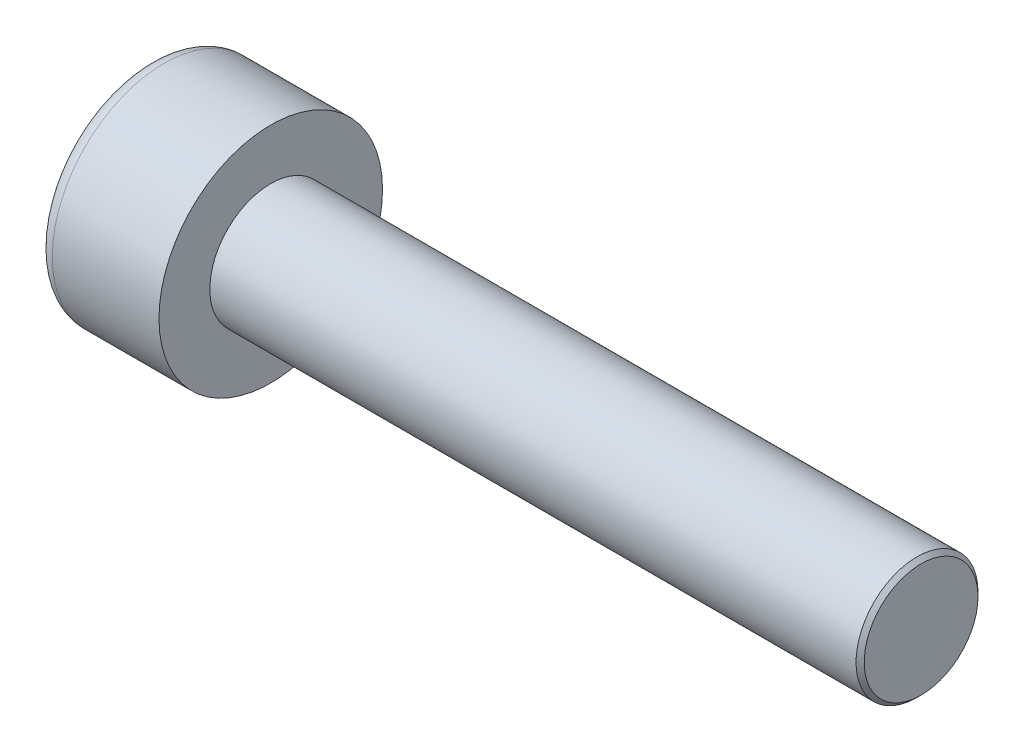
ISO-10303-21;
HEADER;
FILE_DESCRIPTION(('STEP AP214'),'2;1');
FILE_NAME('part.step','',(''),(''),'','','');
FILE_SCHEMA(('AUTOMOTIVE_DESIGN { 1 0 10303 214 1 1 1 1 }'));
ENDSEC;
DATA;
#1=APPLICATION_CONTEXT('core data for automotive mechanical design processes');
#2=APPLICATION_PROTOCOL_DEFINITION('international standard','automotive_design',2000,#1);
#3=PRODUCT_CONTEXT('',#1,'mechanical');
#4=PRODUCT('Part','Part','',(#3));
#5=PRODUCT_RELATED_PRODUCT_CATEGORY('part','',(#4));
#6=PRODUCT_DEFINITION_FORMATION('','',#4);
#7=PRODUCT_DEFINITION_CONTEXT('part definition',#1,'design');
#8=PRODUCT_DEFINITION('design','',#6,#7);
#9=PRODUCT_DEFINITION_SHAPE('','',#8);
#10=(LENGTH_UNIT() NAMED_UNIT(*) SI_UNIT(.MILLI.,.METRE.));
#11=(NAMED_UNIT(*) PLANE_ANGLE_UNIT() SI_UNIT($,.RADIAN.));
#12=(NAMED_UNIT(*) SI_UNIT($,.STERADIAN.) SOLID_ANGLE_UNIT());
#13=UNCERTAINTY_MEASURE_WITH_UNIT(LENGTH_MEASURE(1.E-05),#10,'distance_accuracy_value','');
#14=(GEOMETRIC_REPRESENTATION_CONTEXT(3) GLOBAL_UNCERTAINTY_ASSIGNED_CONTEXT((#13)) GLOBAL_UNIT_ASSIGNED_CONTEXT((#10,
#11,#12)) REPRESENTATION_CONTEXT('',''));
#15=CARTESIAN_POINT('',(0.,0.,0.));
#16=DIRECTION('',(0.,0.,1.));
#17=DIRECTION('',(1.,0.,0.));
#18=AXIS2_PLACEMENT_3D('',#15,#16,#17);
#19=CARTESIAN_POINT('',(1.3,0.,-1.44337567297406));
#20=DIRECTION('',(1.,0.,0.));
#21=DIRECTION('',(0.,0.,-1.));
#22=AXIS2_PLACEMENT_3D('',#19,#20,#21);
#23=PLANE('',#22);
#24=CARTESIAN_POINT('',(1.3,0.,0.));
#25=DIRECTION('',(1.,0.,0.));
#26=DIRECTION('',(0.,0.,-1.));
#27=AXIS2_PLACEMENT_3D('',#24,#25,#26);
#28=CIRCLE('',#27,1.25);
#29=CARTESIAN_POINT('',(1.3,-0.625,-1.08253175473055));
#30=VERTEX_POINT('',#29);
#31=CARTESIAN_POINT('',(1.3,-1.25,0.));
#32=VERTEX_POINT('',#31);
#33=EDGE_CURVE('E172',#30,#32,#28,.F.);
#34=ORIENTED_EDGE('',*,*,#33,.F.);
#35=DIRECTION('',(0.,0.866025403784439,-0.5));
#36=VECTOR('',#35,1.);
#37=CARTESIAN_POINT('',(1.3,-1.25,-0.721687836487033));
#38=LINE('',#37,#36);
#39=CARTESIAN_POINT('',(1.3,-1.25,-0.721687836487033));
#40=VERTEX_POINT('',#39);
#41=EDGE_CURVE('E181',#40,#30,#38,.T.);
#42=ORIENTED_EDGE('',*,*,#41,.F.);
#43=DIRECTION('',(0.,0.,-1.));
#44=VECTOR('',#43,1.);
#45=CARTESIAN_POINT('',(1.3,-1.25,0.721687836487032));
#46=LINE('',#45,#44);
#47=EDGE_CURVE('E203',#32,#40,#46,.T.);
#48=ORIENTED_EDGE('',*,*,#47,.F.);
#49=EDGE_LOOP('',(#34,#42,#48));
#50=FACE_BOUND('',#49,.T.);
#51=ADVANCED_FACE('F47',(#50),#23,.F.);
#52=CARTESIAN_POINT('',(1.3,-0.625,1.08253175473055));
#53=VERTEX_POINT('',#52);
#54=EDGE_CURVE('E330',#32,#53,#28,.F.);
#55=ORIENTED_EDGE('',*,*,#54,.F.);
#56=CARTESIAN_POINT('',(1.3,-1.25,0.721687836487032));
#57=VERTEX_POINT('',#56);
#58=EDGE_CURVE('E204',#57,#32,#46,.T.);
#59=ORIENTED_EDGE('',*,*,#58,.F.);
#60=DIRECTION('',(0.,-0.866025403784439,-0.5));
#61=VECTOR('',#60,1.);
#62=CARTESIAN_POINT('',(1.3,0.,1.44337567297406));
#63=LINE('',#62,#61);
#64=EDGE_CURVE('E198',#53,#57,#63,.T.);
#65=ORIENTED_EDGE('',*,*,#64,.F.);
#66=EDGE_LOOP('',(#55,#59,#65));
#67=FACE_BOUND('',#66,.T.);
#68=ADVANCED_FACE('F137',(#67),#23,.F.);
#69=CARTESIAN_POINT('',(1.3,0.625,1.08253175473055));
#70=VERTEX_POINT('',#69);
#71=EDGE_CURVE('E328',#53,#70,#28,.F.);
#72=ORIENTED_EDGE('',*,*,#71,.F.);
#73=CARTESIAN_POINT('',(1.3,0.,1.44337567297406));
#74=VERTEX_POINT('',#73);
#75=EDGE_CURVE('E199',#74,#53,#63,.T.);
#76=ORIENTED_EDGE('',*,*,#75,.F.);
#77=DIRECTION('',(0.,-0.866025403784439,0.5));
#78=VECTOR('',#77,1.);
#79=CARTESIAN_POINT('',(1.3,1.25,0.721687836487032));
#80=LINE('',#79,#78);
#81=EDGE_CURVE('E193',#70,#74,#80,.T.);
#82=ORIENTED_EDGE('',*,*,#81,.F.);
#83=EDGE_LOOP('',(#72,#76,#82));
#84=FACE_BOUND('',#83,.T.);
#85=ADVANCED_FACE('F143',(#84),#23,.F.);
#86=CARTESIAN_POINT('',(1.3,1.25,0.));
#87=VERTEX_POINT('',#86);
#88=EDGE_CURVE('E169',#70,#87,#28,.F.);
#89=ORIENTED_EDGE('',*,*,#88,.F.);
#90=CARTESIAN_POINT('',(1.3,1.25,0.721687836487032));
#91=VERTEX_POINT('',#90);
#92=EDGE_CURVE('E194',#91,#70,#80,.T.);
#93=ORIENTED_EDGE('',*,*,#92,.F.);
#94=DIRECTION('',(0.,0.,1.));
#95=VECTOR('',#94,1.);
#96=CARTESIAN_POINT('',(1.3,1.25,-0.721687836487032));
#97=LINE('',#96,#95);
#98=EDGE_CURVE('E186',#87,#91,#97,.T.);
#99=ORIENTED_EDGE('',*,*,#98,.F.);
#100=EDGE_LOOP('',(#89,#93,#99));
#101=FACE_BOUND('',#100,.T.);
#102=ADVANCED_FACE('F157',(#101),#23,.F.);
#103=CARTESIAN_POINT('',(1.3,0.,0.));
#104=DIRECTION('',(1.,0.,0.));
#105=DIRECTION('',(0.,0.,-1.));
#106=AXIS2_PLACEMENT_3D('',#103,#104,#105);
#107=CIRCLE('',#106,1.25);
#108=CARTESIAN_POINT('',(1.3,0.625,-1.08253175473055));
#109=VERTEX_POINT('',#108);
#110=EDGE_CURVE('E63',#109,#87,#107,.T.);
#111=ORIENTED_EDGE('',*,*,#110,.T.);
#112=CARTESIAN_POINT('',(1.3,1.25,-0.721687836487032));
#113=VERTEX_POINT('',#112);
#114=EDGE_CURVE('E177',#113,#87,#97,.T.);
#115=ORIENTED_EDGE('',*,*,#114,.F.);
#116=DIRECTION('',(0.,0.866025403784438,0.5));
#117=VECTOR('',#116,1.);
#118=CARTESIAN_POINT('',(1.3,0.,-1.44337567297406));
#119=LINE('',#118,#117);
#120=EDGE_CURVE('E174',#109,#113,#119,.T.);
#121=ORIENTED_EDGE('',*,*,#120,.F.);
#122=EDGE_LOOP('',(#111,#115,#121));
#123=FACE_BOUND('',#122,.T.);
#124=ADVANCED_FACE('F148',(#123),#23,.F.);
#125=EDGE_CURVE('E161',#109,#30,#28,.F.);
#126=ORIENTED_EDGE('',*,*,#125,.F.);
#127=CARTESIAN_POINT('',(1.3,0.,-1.44337567297406));
#128=VERTEX_POINT('',#127);
#129=EDGE_CURVE('E164',#128,#109,#119,.T.);
#130=ORIENTED_EDGE('',*,*,#129,.F.);
#131=EDGE_CURVE('E166',#30,#128,#38,.T.);
#132=ORIENTED_EDGE('',*,*,#131,.F.);
#133=EDGE_LOOP('',(#126,#130,#132));
#134=FACE_BOUND('',#133,.T.);
#135=ADVANCED_FACE('F139',(#134),#23,.F.);
#136=CARTESIAN_POINT('',(0.,0.,0.));
#137=DIRECTION('',(1.,0.,0.));
#138=DIRECTION('',(0.,0.,-1.));
#139=AXIS2_PLACEMENT_3D('',#136,#137,#138);
#140=PLANE('',#139);
#141=CARTESIAN_POINT('',(0.,0.,0.));
#142=DIRECTION('',(1.,0.,0.));
#143=DIRECTION('',(0.,0.,-1.));
#144=AXIS2_PLACEMENT_3D('',#141,#142,#143);
#145=CIRCLE('',#144,2.375);
#146=CARTESIAN_POINT('',(0.,0.,-2.375));
#147=VERTEX_POINT('',#146);
#148=EDGE_CURVE('E258',#147,#147,#145,.F.);
#149=ORIENTED_EDGE('',*,*,#148,.T.);
#150=EDGE_LOOP('',(#149));
#151=FACE_BOUND('',#150,.T.);
#152=DIRECTION('',(0.,0.866025403784439,-0.5));
#153=VECTOR('',#152,1.);
#154=CARTESIAN_POINT('',(0.,-1.25,-0.721687836487033));
#155=LINE('',#154,#153);
#156=CARTESIAN_POINT('',(0.,-1.25,-0.721687836487033));
#157=VERTEX_POINT('',#156);
#158=CARTESIAN_POINT('',(0.,0.,-1.44337567297406));
#159=VERTEX_POINT('',#158);
#160=EDGE_CURVE('E71',#157,#159,#155,.T.);
#161=ORIENTED_EDGE('',*,*,#160,.T.);
#162=DIRECTION('',(0.,0.866025403784438,0.5));
#163=VECTOR('',#162,1.);
#164=CARTESIAN_POINT('',(0.,0.,-1.44337567297406));
#165=LINE('',#164,#163);
#166=CARTESIAN_POINT('',(0.,1.25,-0.721687836487032));
#167=VERTEX_POINT('',#166);
#168=EDGE_CURVE('E211',#159,#167,#165,.T.);
#169=ORIENTED_EDGE('',*,*,#168,.T.);
#170=DIRECTION('',(0.,0.,1.));
#171=VECTOR('',#170,1.);
#172=CARTESIAN_POINT('',(0.,1.25,-0.721687836487032));
#173=LINE('',#172,#171);
#174=CARTESIAN_POINT('',(0.,1.25,0.721687836487032));
#175=VERTEX_POINT('',#174);
#176=EDGE_CURVE('E215',#167,#175,#173,.T.);
#177=ORIENTED_EDGE('',*,*,#176,.T.);
#178=DIRECTION('',(0.,-0.866025403784439,0.5));
#179=VECTOR('',#178,1.);
#180=CARTESIAN_POINT('',(0.,1.25,0.721687836487032));
#181=LINE('',#180,#179);
#182=CARTESIAN_POINT('',(0.,0.,1.44337567297406));
#183=VERTEX_POINT('',#182);
#184=EDGE_CURVE('E219',#175,#183,#181,.T.);
#185=ORIENTED_EDGE('',*,*,#184,.T.);
#186=DIRECTION('',(0.,-0.866025403784439,-0.5));
#187=VECTOR('',#186,1.);
#188=CARTESIAN_POINT('',(0.,0.,1.44337567297406));
#189=LINE('',#188,#187);
#190=CARTESIAN_POINT('',(0.,-1.25,0.721687836487032));
#191=VERTEX_POINT('',#190);
#192=EDGE_CURVE('E223',#183,#191,#189,.T.);
#193=ORIENTED_EDGE('',*,*,#192,.T.);
#194=DIRECTION('',(0.,0.,-1.));
#195=VECTOR('',#194,1.);
#196=CARTESIAN_POINT('',(0.,-1.25,0.721687836487032));
#197=LINE('',#196,#195);
#198=EDGE_CURVE('E227',#191,#157,#197,.T.);
#199=ORIENTED_EDGE('',*,*,#198,.T.);
#200=EDGE_LOOP('',(#161,#169,#177,#185,#193,#199));
#201=FACE_BOUND('',#200,.T.);
#202=ADVANCED_FACE('F147',(#151,#201),#140,.F.);
#203=CARTESIAN_POINT('',(3.,0.,0.));
#204=DIRECTION('',(1.,0.,0.));
#205=DIRECTION('',(0.,0.,-1.));
#206=AXIS2_PLACEMENT_3D('',#203,#204,#205);
#207=PLANE('',#206);
#208=CARTESIAN_POINT('',(3.,0.,0.));
#209=DIRECTION('',(1.,0.,0.));
#210=DIRECTION('',(0.,0.,-1.));
#211=AXIS2_PLACEMENT_3D('',#208,#209,#210);
#212=CIRCLE('',#211,2.75);
#213=CARTESIAN_POINT('',(3.,0.,-2.75));
#214=VERTEX_POINT('',#213);
#215=EDGE_CURVE('E170',#214,#214,#212,.T.);
#216=ORIENTED_EDGE('',*,*,#215,.T.);
#217=EDGE_LOOP('',(#216));
#218=FACE_BOUND('',#217,.T.);
#219=CARTESIAN_POINT('',(3.,0.,0.));
#220=DIRECTION('',(1.,0.,0.));
#221=DIRECTION('',(0.,0.,-1.));
#222=AXIS2_PLACEMENT_3D('',#219,#220,#221);
#223=CIRCLE('',#222,1.5);
#224=CARTESIAN_POINT('',(3.,0.,-1.5));
#225=VERTEX_POINT('',#224);
#226=EDGE_CURVE('E247',#225,#225,#223,.T.);
#227=ORIENTED_EDGE('',*,*,#226,.F.);
#228=EDGE_LOOP('',(#227));
#229=FACE_BOUND('',#228,.T.);
#230=ADVANCED_FACE('F154',(#218,#229),#207,.T.);
#231=CARTESIAN_POINT('',(3.,0.,0.));
#232=DIRECTION('',(-1.,0.,0.));
#233=DIRECTION('',(0.,0.,1.));
#234=AXIS2_PLACEMENT_3D('',#231,#232,#233);
#235=CYLINDRICAL_SURFACE('',#234,2.75);
#236=CARTESIAN_POINT('',(0.375,0.,0.));
#237=DIRECTION('',(1.,0.,0.));
#238=DIRECTION('',(0.,0.,-1.));
#239=AXIS2_PLACEMENT_3D('',#236,#237,#238);
#240=CIRCLE('',#239,2.75);
#241=CARTESIAN_POINT('',(0.375,0.,-2.75));
#242=VERTEX_POINT('',#241);
#243=EDGE_CURVE('E254',#242,#242,#240,.T.);
#244=ORIENTED_EDGE('',*,*,#243,.T.);
#245=EDGE_LOOP('',(#244));
#246=FACE_BOUND('',#245,.T.);
#247=ORIENTED_EDGE('',*,*,#215,.F.);
#248=EDGE_LOOP('',(#247));
#249=FACE_BOUND('',#248,.T.);
#250=ADVANCED_FACE('F276',(#246,#249),#235,.T.);
#251=CARTESIAN_POINT('',(19.,0.,0.));
#252=DIRECTION('',(-1.,0.,0.));
#253=DIRECTION('',(0.,0.,1.));
#254=AXIS2_PLACEMENT_3D('',#251,#252,#253);
#255=CYLINDRICAL_SURFACE('',#254,1.5);
#256=CARTESIAN_POINT('',(18.9,0.,0.));
#257=DIRECTION('',(1.,0.,0.));
#258=DIRECTION('',(0.,0.,-1.));
#259=AXIS2_PLACEMENT_3D('',#256,#257,#258);
#260=CIRCLE('',#259,1.5);
#261=CARTESIAN_POINT('',(18.9,0.,-1.5));
#262=VERTEX_POINT('',#261);
#263=EDGE_CURVE('E11',#262,#262,#260,.F.);
#264=ORIENTED_EDGE('',*,*,#263,.T.);
#265=EDGE_LOOP('',(#264));
#266=FACE_BOUND('',#265,.T.);
#267=ORIENTED_EDGE('',*,*,#226,.T.);
#268=EDGE_LOOP('',(#267));
#269=FACE_BOUND('',#268,.T.);
#270=ADVANCED_FACE('F273',(#266,#269),#255,.T.);
#271=CARTESIAN_POINT('',(19.,0.,0.));
#272=DIRECTION('',(1.,0.,0.));
#273=DIRECTION('',(0.,0.,-1.));
#274=AXIS2_PLACEMENT_3D('',#271,#272,#273);
#275=PLANE('',#274);
#276=CARTESIAN_POINT('',(19.,0.,0.));
#277=DIRECTION('',(1.,0.,0.));
#278=DIRECTION('',(0.,0.,-1.));
#279=AXIS2_PLACEMENT_3D('',#276,#277,#278);
#280=CIRCLE('',#279,1.4);
#281=CARTESIAN_POINT('',(19.,0.,-1.4));
#282=VERTEX_POINT('',#281);
#283=EDGE_CURVE('E56',#282,#282,#280,.T.);
#284=ORIENTED_EDGE('',*,*,#283,.T.);
#285=EDGE_LOOP('',(#284));
#286=FACE_BOUND('',#285,.T.);
#287=ADVANCED_FACE('F265',(#286),#275,.T.);
#288=CARTESIAN_POINT('',(1.3,-1.25,-0.721687836487033));
#289=DIRECTION('',(0.,0.5,0.866025403784439));
#290=DIRECTION('',(0.,-0.866025403784439,0.5));
#291=AXIS2_PLACEMENT_3D('',#288,#289,#290);
#292=PLANE('',#291);
#293=ORIENTED_EDGE('',*,*,#160,.F.);
#294=DIRECTION('',(-1.,0.,0.));
#295=VECTOR('',#294,1.);
#296=CARTESIAN_POINT('',(1.3,-1.25,-0.721687836487033));
#297=LINE('',#296,#295);
#298=EDGE_CURVE('E208',#40,#157,#297,.T.);
#299=ORIENTED_EDGE('',*,*,#298,.F.);
#300=ORIENTED_EDGE('',*,*,#41,.T.);
#301=ORIENTED_EDGE('',*,*,#131,.T.);
#302=DIRECTION('',(-1.,0.,0.));
#303=VECTOR('',#302,1.);
#304=CARTESIAN_POINT('',(1.3,0.,-1.44337567297406));
#305=LINE('',#304,#303);
#306=EDGE_CURVE('E184',#128,#159,#305,.T.);
#307=ORIENTED_EDGE('',*,*,#306,.T.);
#308=EDGE_LOOP('',(#293,#299,#300,#301,#307));
#309=FACE_BOUND('',#308,.T.);
#310=ADVANCED_FACE('F291',(#309),#292,.T.);
#311=CARTESIAN_POINT('',(1.3,0.,-1.44337567297406));
#312=DIRECTION('',(0.,-0.5,0.866025403784438));
#313=DIRECTION('',(0.,-0.866025403784439,-0.5));
#314=AXIS2_PLACEMENT_3D('',#311,#312,#313);
#315=PLANE('',#314);
#316=ORIENTED_EDGE('',*,*,#168,.F.);
#317=ORIENTED_EDGE('',*,*,#306,.F.);
#318=ORIENTED_EDGE('',*,*,#129,.T.);
#319=ORIENTED_EDGE('',*,*,#120,.T.);
#320=DIRECTION('',(-1.,0.,0.));
#321=VECTOR('',#320,1.);
#322=CARTESIAN_POINT('',(1.3,1.25,-0.721687836487032));
#323=LINE('',#322,#321);
#324=EDGE_CURVE('E242',#113,#167,#323,.T.);
#325=ORIENTED_EDGE('',*,*,#324,.T.);
#326=EDGE_LOOP('',(#316,#317,#318,#319,#325));
#327=FACE_BOUND('',#326,.T.);
#328=ADVANCED_FACE('F183',(#327),#315,.T.);
#329=CARTESIAN_POINT('',(1.3,1.25,-0.721687836487032));
#330=DIRECTION('',(0.,-1.,0.));
#331=DIRECTION('',(0.,0.,-1.));
#332=AXIS2_PLACEMENT_3D('',#329,#330,#331);
#333=PLANE('',#332);
#334=ORIENTED_EDGE('',*,*,#176,.F.);
#335=ORIENTED_EDGE('',*,*,#324,.F.);
#336=ORIENTED_EDGE('',*,*,#114,.T.);
#337=ORIENTED_EDGE('',*,*,#98,.T.);
#338=DIRECTION('',(-1.,0.,0.));
#339=VECTOR('',#338,1.);
#340=CARTESIAN_POINT('',(1.3,1.25,0.721687836487032));
#341=LINE('',#340,#339);
#342=EDGE_CURVE('E239',#91,#175,#341,.T.);
#343=ORIENTED_EDGE('',*,*,#342,.T.);
#344=EDGE_LOOP('',(#334,#335,#336,#337,#343));
#345=FACE_BOUND('',#344,.T.);
#346=ADVANCED_FACE('F296',(#345),#333,.T.);
#347=CARTESIAN_POINT('',(1.3,1.25,0.721687836487032));
#348=DIRECTION('',(0.,-0.5,-0.866025403784439));
#349=DIRECTION('',(0.,0.866025403784439,-0.5));
#350=AXIS2_PLACEMENT_3D('',#347,#348,#349);
#351=PLANE('',#350);
#352=ORIENTED_EDGE('',*,*,#184,.F.);
#353=ORIENTED_EDGE('',*,*,#342,.F.);
#354=ORIENTED_EDGE('',*,*,#92,.T.);
#355=ORIENTED_EDGE('',*,*,#81,.T.);
#356=DIRECTION('',(-1.,0.,0.));
#357=VECTOR('',#356,1.);
#358=CARTESIAN_POINT('',(1.3,0.,1.44337567297406));
#359=LINE('',#358,#357);
#360=EDGE_CURVE('E236',#74,#183,#359,.T.);
#361=ORIENTED_EDGE('',*,*,#360,.T.);
#362=EDGE_LOOP('',(#352,#353,#354,#355,#361));
#363=FACE_BOUND('',#362,.T.);
#364=ADVANCED_FACE('F299',(#363),#351,.T.);
#365=CARTESIAN_POINT('',(1.3,0.,1.44337567297406));
#366=DIRECTION('',(0.,0.5,-0.866025403784439));
#367=DIRECTION('',(0.,0.866025403784439,0.5));
#368=AXIS2_PLACEMENT_3D('',#365,#366,#367);
#369=PLANE('',#368);
#370=ORIENTED_EDGE('',*,*,#192,.F.);
#371=ORIENTED_EDGE('',*,*,#360,.F.);
#372=ORIENTED_EDGE('',*,*,#75,.T.);
#373=ORIENTED_EDGE('',*,*,#64,.T.);
#374=DIRECTION('',(-1.,0.,0.));
#375=VECTOR('',#374,1.);
#376=CARTESIAN_POINT('',(1.3,-1.25,0.721687836487032));
#377=LINE('',#376,#375);
#378=EDGE_CURVE('E233',#57,#191,#377,.T.);
#379=ORIENTED_EDGE('',*,*,#378,.T.);
#380=EDGE_LOOP('',(#370,#371,#372,#373,#379));
#381=FACE_BOUND('',#380,.T.);
#382=ADVANCED_FACE('F132',(#381),#369,.T.);
#383=CARTESIAN_POINT('',(1.3,-1.25,0.721687836487032));
#384=DIRECTION('',(0.,1.,0.));
#385=DIRECTION('',(0.,0.,1.));
#386=AXIS2_PLACEMENT_3D('',#383,#384,#385);
#387=PLANE('',#386);
#388=ORIENTED_EDGE('',*,*,#198,.F.);
#389=ORIENTED_EDGE('',*,*,#378,.F.);
#390=ORIENTED_EDGE('',*,*,#58,.T.);
#391=ORIENTED_EDGE('',*,*,#47,.T.);
#392=ORIENTED_EDGE('',*,*,#298,.T.);
#393=EDGE_LOOP('',(#388,#389,#390,#391,#392));
#394=FACE_BOUND('',#393,.T.);
#395=ADVANCED_FACE('F125',(#394),#387,.T.);
#396=CARTESIAN_POINT('',(1.3,0.,0.));
#397=DIRECTION('',(-1.,0.,0.));
#398=DIRECTION('',(0.,0.,1.));
#399=AXIS2_PLACEMENT_3D('',#396,#397,#398);
#400=CONICAL_SURFACE('',#399,1.25,1.04719755119659);
#401=CARTESIAN_POINT('',(2.02168783648704,0.,0.));
#402=VERTEX_POINT('',#401);
#403=VERTEX_LOOP('',#402);
#404=FACE_BOUND('',#403,.T.);
#405=ORIENTED_EDGE('',*,*,#110,.F.);
#406=ORIENTED_EDGE('',*,*,#125,.T.);
#407=ORIENTED_EDGE('',*,*,#33,.T.);
#408=ORIENTED_EDGE('',*,*,#54,.T.);
#409=ORIENTED_EDGE('',*,*,#71,.T.);
#410=ORIENTED_EDGE('',*,*,#88,.T.);
#411=EDGE_LOOP('',(#405,#406,#407,#408,#409,#410));
#412=FACE_BOUND('',#411,.T.);
#413=ADVANCED_FACE('F122',(#404,#412),#400,.F.);
#414=CARTESIAN_POINT('',(0.375,0.,0.));
#415=DIRECTION('',(1.,0.,0.));
#416=DIRECTION('',(0.,0.,-1.));
#417=AXIS2_PLACEMENT_3D('',#414,#415,#416);
#418=TOROIDAL_SURFACE('',#417,2.375,0.375);
#419=ORIENTED_EDGE('',*,*,#148,.F.);
#420=EDGE_LOOP('',(#419));
#421=FACE_BOUND('',#420,.T.);
#422=ORIENTED_EDGE('',*,*,#243,.F.);
#423=EDGE_LOOP('',(#422));
#424=FACE_BOUND('',#423,.T.);
#425=ADVANCED_FACE('F124',(#421,#424),#418,.T.);
#426=CARTESIAN_POINT('',(19.,0.,0.));
#427=DIRECTION('',(-1.,0.,0.));
#428=DIRECTION('',(0.,0.,1.));
#429=AXIS2_PLACEMENT_3D('',#426,#427,#428);
#430=CONICAL_SURFACE('',#429,1.4,0.785398163397443);
#431=ORIENTED_EDGE('',*,*,#263,.F.);
#432=EDGE_LOOP('',(#431));
#433=FACE_BOUND('',#432,.T.);
#434=ORIENTED_EDGE('',*,*,#283,.F.);
#435=EDGE_LOOP('',(#434));
#436=FACE_BOUND('',#435,.T.);
#437=ADVANCED_FACE('F49',(#433,#436),#430,.T.);
#438=CLOSED_SHELL('',(#51,#68,#85,#102,#124,#135,#202,#230,#250,#270,#287,#310,#328,#346,#364,
#382,#395,#413,#425,#437));
#439=MANIFOLD_SOLID_BREP('B2',#438);
#440=ADVANCED_BREP_SHAPE_REPRESENTATION('',(#18,#439),#14);
#441=SHAPE_DEFINITION_REPRESENTATION(#9,#440);
ENDSEC;
END-ISO-10303-21;
